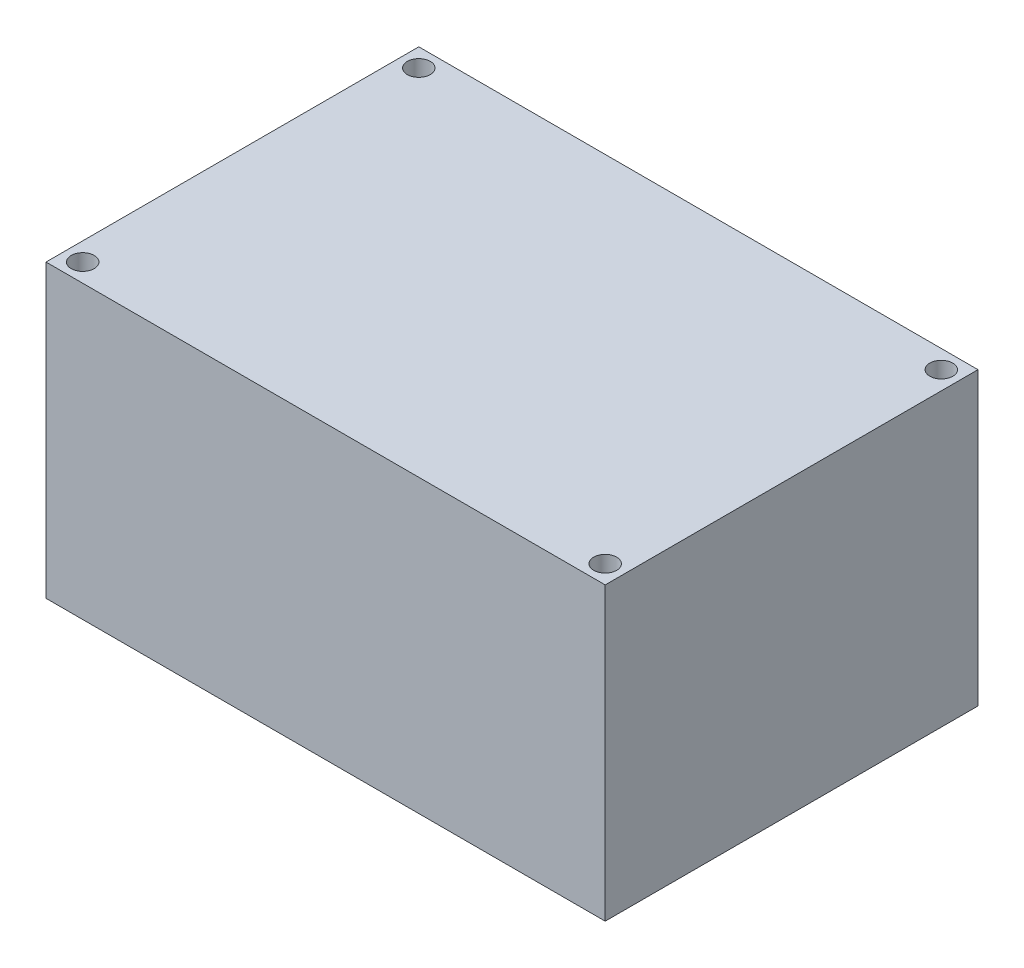
ISO-10303-21;
HEADER;
FILE_DESCRIPTION(('STEP AP214'),'2;1');
FILE_NAME('part.step','',(''),(''),'','','');
FILE_SCHEMA(('AUTOMOTIVE_DESIGN { 1 0 10303 214 1 1 1 1 }'));
ENDSEC;
DATA;
#1=APPLICATION_CONTEXT('core data for automotive mechanical design processes');
#2=APPLICATION_PROTOCOL_DEFINITION('international standard','automotive_design',2000,#1);
#3=PRODUCT_CONTEXT('',#1,'mechanical');
#4=PRODUCT('Part','Part','',(#3));
#5=PRODUCT_RELATED_PRODUCT_CATEGORY('part','',(#4));
#6=PRODUCT_DEFINITION_FORMATION('','',#4);
#7=PRODUCT_DEFINITION_CONTEXT('part definition',#1,'design');
#8=PRODUCT_DEFINITION('design','',#6,#7);
#9=PRODUCT_DEFINITION_SHAPE('','',#8);
#10=(LENGTH_UNIT() NAMED_UNIT(*) SI_UNIT(.MILLI.,.METRE.));
#11=(NAMED_UNIT(*) PLANE_ANGLE_UNIT() SI_UNIT($,.RADIAN.));
#12=(NAMED_UNIT(*) SI_UNIT($,.STERADIAN.) SOLID_ANGLE_UNIT());
#13=UNCERTAINTY_MEASURE_WITH_UNIT(LENGTH_MEASURE(1.E-05),#10,'distance_accuracy_value','');
#14=(GEOMETRIC_REPRESENTATION_CONTEXT(3) GLOBAL_UNCERTAINTY_ASSIGNED_CONTEXT((#13)) GLOBAL_UNIT_ASSIGNED_CONTEXT((#10,
#11,#12)) REPRESENTATION_CONTEXT('',''));
#15=CARTESIAN_POINT('',(0.,0.,0.));
#16=DIRECTION('',(0.,0.,1.));
#17=DIRECTION('',(1.,0.,0.));
#18=AXIS2_PLACEMENT_3D('',#15,#16,#17);
#19=CARTESIAN_POINT('',(0.,31.75,0.));
#20=DIRECTION('',(-1.,0.,0.));
#21=DIRECTION('',(0.,0.,1.));
#22=AXIS2_PLACEMENT_3D('',#19,#20,#21);
#23=PLANE('',#22);
#24=DIRECTION('',(0.,0.,-1.));
#25=VECTOR('',#24,1.);
#26=CARTESIAN_POINT('',(0.,0.,0.));
#27=LINE('',#26,#25);
#28=CARTESIAN_POINT('',(0.,0.,0.));
#29=VERTEX_POINT('',#28);
#30=CARTESIAN_POINT('',(0.,0.,-40.64));
#31=VERTEX_POINT('',#30);
#32=EDGE_CURVE('E100',#29,#31,#27,.T.);
#33=ORIENTED_EDGE('',*,*,#32,.T.);
#34=DIRECTION('',(0.,-1.,0.));
#35=VECTOR('',#34,1.);
#36=CARTESIAN_POINT('',(0.,31.75,-40.64));
#37=LINE('',#36,#35);
#38=CARTESIAN_POINT('',(0.,31.75,-40.64));
#39=VERTEX_POINT('',#38);
#40=EDGE_CURVE('E11',#39,#31,#37,.T.);
#41=ORIENTED_EDGE('',*,*,#40,.F.);
#42=DIRECTION('',(0.,0.,-1.));
#43=VECTOR('',#42,1.);
#44=CARTESIAN_POINT('',(0.,31.75,0.));
#45=LINE('',#44,#43);
#46=CARTESIAN_POINT('',(0.,31.75,0.));
#47=VERTEX_POINT('',#46);
#48=EDGE_CURVE('E86',#47,#39,#45,.T.);
#49=ORIENTED_EDGE('',*,*,#48,.F.);
#50=DIRECTION('',(0.,-1.,0.));
#51=VECTOR('',#50,1.);
#52=CARTESIAN_POINT('',(0.,31.75,0.));
#53=LINE('',#52,#51);
#54=EDGE_CURVE('E53',#47,#29,#53,.T.);
#55=ORIENTED_EDGE('',*,*,#54,.T.);
#56=EDGE_LOOP('',(#33,#41,#49,#55));
#57=FACE_BOUND('',#56,.T.);
#58=ADVANCED_FACE('F37',(#57),#23,.F.);
#59=CARTESIAN_POINT('',(0.,31.75,-40.64));
#60=DIRECTION('',(0.,0.,1.));
#61=DIRECTION('',(1.,0.,0.));
#62=AXIS2_PLACEMENT_3D('',#59,#60,#61);
#63=PLANE('',#62);
#64=DIRECTION('',(-1.,0.,0.));
#65=VECTOR('',#64,1.);
#66=CARTESIAN_POINT('',(0.,0.,-40.64));
#67=LINE('',#66,#65);
#68=CARTESIAN_POINT('',(-60.96,0.,-40.64));
#69=VERTEX_POINT('',#68);
#70=EDGE_CURVE('E91',#31,#69,#67,.T.);
#71=ORIENTED_EDGE('',*,*,#70,.T.);
#72=DIRECTION('',(0.,-1.,0.));
#73=VECTOR('',#72,1.);
#74=CARTESIAN_POINT('',(-60.96,31.75,-40.64));
#75=LINE('',#74,#73);
#76=CARTESIAN_POINT('',(-60.96,31.75,-40.64));
#77=VERTEX_POINT('',#76);
#78=EDGE_CURVE('E45',#77,#69,#75,.T.);
#79=ORIENTED_EDGE('',*,*,#78,.F.);
#80=DIRECTION('',(-1.,0.,0.));
#81=VECTOR('',#80,1.);
#82=CARTESIAN_POINT('',(0.,31.75,-40.64));
#83=LINE('',#82,#81);
#84=EDGE_CURVE('E78',#39,#77,#83,.T.);
#85=ORIENTED_EDGE('',*,*,#84,.F.);
#86=ORIENTED_EDGE('',*,*,#40,.T.);
#87=EDGE_LOOP('',(#71,#79,#85,#86));
#88=FACE_BOUND('',#87,.T.);
#89=ADVANCED_FACE('F90',(#88),#63,.F.);
#90=CARTESIAN_POINT('',(-60.96,31.75,0.));
#91=DIRECTION('',(-1.,0.,0.));
#92=DIRECTION('',(0.,0.,1.));
#93=AXIS2_PLACEMENT_3D('',#90,#91,#92);
#94=PLANE('',#93);
#95=DIRECTION('',(0.,0.,-1.));
#96=VECTOR('',#95,1.);
#97=CARTESIAN_POINT('',(-60.96,0.,0.));
#98=LINE('',#97,#96);
#99=CARTESIAN_POINT('',(-60.96,0.,0.));
#100=VERTEX_POINT('',#99);
#101=EDGE_CURVE('E104',#100,#69,#98,.T.);
#102=ORIENTED_EDGE('',*,*,#101,.F.);
#103=DIRECTION('',(0.,-1.,0.));
#104=VECTOR('',#103,1.);
#105=CARTESIAN_POINT('',(-60.96,31.75,0.));
#106=LINE('',#105,#104);
#107=CARTESIAN_POINT('',(-60.96,31.75,0.));
#108=VERTEX_POINT('',#107);
#109=EDGE_CURVE('E67',#108,#100,#106,.T.);
#110=ORIENTED_EDGE('',*,*,#109,.F.);
#111=DIRECTION('',(0.,0.,-1.));
#112=VECTOR('',#111,1.);
#113=CARTESIAN_POINT('',(-60.96,31.75,0.));
#114=LINE('',#113,#112);
#115=EDGE_CURVE('E85',#108,#77,#114,.T.);
#116=ORIENTED_EDGE('',*,*,#115,.T.);
#117=ORIENTED_EDGE('',*,*,#78,.T.);
#118=EDGE_LOOP('',(#102,#110,#116,#117));
#119=FACE_BOUND('',#118,.T.);
#120=ADVANCED_FACE('F94',(#119),#94,.T.);
#121=CARTESIAN_POINT('',(0.,31.75,0.));
#122=DIRECTION('',(0.,0.,1.));
#123=DIRECTION('',(1.,0.,0.));
#124=AXIS2_PLACEMENT_3D('',#121,#122,#123);
#125=PLANE('',#124);
#126=DIRECTION('',(-1.,0.,0.));
#127=VECTOR('',#126,1.);
#128=CARTESIAN_POINT('',(0.,0.,0.));
#129=LINE('',#128,#127);
#130=EDGE_CURVE('E106',#29,#100,#129,.T.);
#131=ORIENTED_EDGE('',*,*,#130,.F.);
#132=ORIENTED_EDGE('',*,*,#54,.F.);
#133=DIRECTION('',(-1.,0.,0.));
#134=VECTOR('',#133,1.);
#135=CARTESIAN_POINT('',(0.,31.75,0.));
#136=LINE('',#135,#134);
#137=EDGE_CURVE('E95',#47,#108,#136,.T.);
#138=ORIENTED_EDGE('',*,*,#137,.T.);
#139=ORIENTED_EDGE('',*,*,#109,.T.);
#140=EDGE_LOOP('',(#131,#132,#138,#139));
#141=FACE_BOUND('',#140,.T.);
#142=ADVANCED_FACE('F141',(#141),#125,.T.);
#143=CARTESIAN_POINT('',(0.,31.75,0.));
#144=DIRECTION('',(0.,1.,0.));
#145=DIRECTION('',(0.,0.,1.));
#146=AXIS2_PLACEMENT_3D('',#143,#144,#145);
#147=PLANE('',#146);
#148=CARTESIAN_POINT('',(-58.96,31.75,-2.));
#149=DIRECTION('',(0.,1.,0.));
#150=DIRECTION('',(0.,0.,1.));
#151=AXIS2_PLACEMENT_3D('',#148,#149,#150);
#152=CIRCLE('',#151,1.25195902446179);
#153=CARTESIAN_POINT('',(-58.96,31.75,-0.748040975538209));
#154=VERTEX_POINT('',#153);
#155=EDGE_CURVE('E121',#154,#154,#152,.T.);
#156=ORIENTED_EDGE('',*,*,#155,.F.);
#157=EDGE_LOOP('',(#156));
#158=FACE_BOUND('',#157,.T.);
#159=CARTESIAN_POINT('',(-58.96,31.75,-38.64));
#160=DIRECTION('',(0.,1.,0.));
#161=DIRECTION('',(0.,0.,1.));
#162=AXIS2_PLACEMENT_3D('',#159,#160,#161);
#163=CIRCLE('',#162,1.25249627932758);
#164=CARTESIAN_POINT('',(-58.96,31.75,-37.3875037206724));
#165=VERTEX_POINT('',#164);
#166=EDGE_CURVE('E127',#165,#165,#163,.T.);
#167=ORIENTED_EDGE('',*,*,#166,.F.);
#168=EDGE_LOOP('',(#167));
#169=FACE_BOUND('',#168,.T.);
#170=CARTESIAN_POINT('',(-1.99971202499648,31.75,-38.64));
#171=DIRECTION('',(0.,1.,0.));
#172=DIRECTION('',(0.,0.,1.));
#173=AXIS2_PLACEMENT_3D('',#170,#171,#172);
#174=CIRCLE('',#173,1.25);
#175=CARTESIAN_POINT('',(-1.99971202499648,31.75,-37.39));
#176=VERTEX_POINT('',#175);
#177=EDGE_CURVE('E115',#176,#176,#174,.T.);
#178=ORIENTED_EDGE('',*,*,#177,.F.);
#179=EDGE_LOOP('',(#178));
#180=FACE_BOUND('',#179,.T.);
#181=CARTESIAN_POINT('',(-1.99971202499648,31.75,-2.));
#182=DIRECTION('',(0.,1.,0.));
#183=DIRECTION('',(0.,0.,1.));
#184=AXIS2_PLACEMENT_3D('',#181,#182,#183);
#185=CIRCLE('',#184,1.24924995833157);
#186=CARTESIAN_POINT('',(-1.99971202499648,31.75,-0.750750041668428));
#187=VERTEX_POINT('',#186);
#188=EDGE_CURVE('E112',#187,#187,#185,.T.);
#189=ORIENTED_EDGE('',*,*,#188,.F.);
#190=EDGE_LOOP('',(#189));
#191=FACE_BOUND('',#190,.T.);
#192=ORIENTED_EDGE('',*,*,#48,.T.);
#193=ORIENTED_EDGE('',*,*,#84,.T.);
#194=ORIENTED_EDGE('',*,*,#115,.F.);
#195=ORIENTED_EDGE('',*,*,#137,.F.);
#196=EDGE_LOOP('',(#192,#193,#194,#195));
#197=FACE_BOUND('',#196,.T.);
#198=ADVANCED_FACE('F82',(#158,#169,#180,#191,#197),#147,.T.);
#199=CARTESIAN_POINT('',(0.,0.,0.));
#200=DIRECTION('',(0.,1.,0.));
#201=DIRECTION('',(0.,0.,1.));
#202=AXIS2_PLACEMENT_3D('',#199,#200,#201);
#203=PLANE('',#202);
#204=CARTESIAN_POINT('',(-58.96,0.,-2.));
#205=DIRECTION('',(0.,1.,0.));
#206=DIRECTION('',(0.,0.,1.));
#207=AXIS2_PLACEMENT_3D('',#204,#205,#206);
#208=CIRCLE('',#207,1.25195902446179);
#209=CARTESIAN_POINT('',(-58.96,0.,-0.748040975538209));
#210=VERTEX_POINT('',#209);
#211=EDGE_CURVE('E118',#210,#210,#208,.T.);
#212=ORIENTED_EDGE('',*,*,#211,.T.);
#213=EDGE_LOOP('',(#212));
#214=FACE_BOUND('',#213,.T.);
#215=CARTESIAN_POINT('',(-58.96,0.,-38.64));
#216=DIRECTION('',(0.,1.,0.));
#217=DIRECTION('',(0.,0.,1.));
#218=AXIS2_PLACEMENT_3D('',#215,#216,#217);
#219=CIRCLE('',#218,1.25249627932758);
#220=CARTESIAN_POINT('',(-58.96,0.,-37.3875037206724));
#221=VERTEX_POINT('',#220);
#222=EDGE_CURVE('E124',#221,#221,#219,.T.);
#223=ORIENTED_EDGE('',*,*,#222,.T.);
#224=EDGE_LOOP('',(#223));
#225=FACE_BOUND('',#224,.T.);
#226=CARTESIAN_POINT('',(-1.99971202499648,0.,-38.64));
#227=DIRECTION('',(0.,1.,0.));
#228=DIRECTION('',(0.,0.,1.));
#229=AXIS2_PLACEMENT_3D('',#226,#227,#228);
#230=CIRCLE('',#229,1.25);
#231=CARTESIAN_POINT('',(-1.99971202499648,0.,-37.39));
#232=VERTEX_POINT('',#231);
#233=EDGE_CURVE('E130',#232,#232,#230,.T.);
#234=ORIENTED_EDGE('',*,*,#233,.T.);
#235=EDGE_LOOP('',(#234));
#236=FACE_BOUND('',#235,.T.);
#237=CARTESIAN_POINT('',(-1.99971202499648,0.,-2.));
#238=DIRECTION('',(0.,1.,0.));
#239=DIRECTION('',(0.,0.,1.));
#240=AXIS2_PLACEMENT_3D('',#237,#238,#239);
#241=CIRCLE('',#240,1.24924995833157);
#242=CARTESIAN_POINT('',(-1.99971202499648,0.,-0.750750041668428));
#243=VERTEX_POINT('',#242);
#244=EDGE_CURVE('E102',#243,#243,#241,.T.);
#245=ORIENTED_EDGE('',*,*,#244,.T.);
#246=EDGE_LOOP('',(#245));
#247=FACE_BOUND('',#246,.T.);
#248=ORIENTED_EDGE('',*,*,#32,.F.);
#249=ORIENTED_EDGE('',*,*,#130,.T.);
#250=ORIENTED_EDGE('',*,*,#101,.T.);
#251=ORIENTED_EDGE('',*,*,#70,.F.);
#252=EDGE_LOOP('',(#248,#249,#250,#251));
#253=FACE_BOUND('',#252,.T.);
#254=ADVANCED_FACE('F140',(#214,#225,#236,#247,#253),#203,.F.);
#255=CARTESIAN_POINT('',(-1.99971202499648,0.,-2.));
#256=DIRECTION('',(0.,1.,0.));
#257=DIRECTION('',(0.,0.,1.));
#258=AXIS2_PLACEMENT_3D('',#255,#256,#257);
#259=CYLINDRICAL_SURFACE('',#258,1.24924995833157);
#260=ORIENTED_EDGE('',*,*,#244,.F.);
#261=EDGE_LOOP('',(#260));
#262=FACE_BOUND('',#261,.T.);
#263=ORIENTED_EDGE('',*,*,#188,.T.);
#264=EDGE_LOOP('',(#263));
#265=FACE_BOUND('',#264,.T.);
#266=ADVANCED_FACE('F146',(#262,#265),#259,.F.);
#267=CARTESIAN_POINT('',(-1.99971202499648,0.,-38.64));
#268=DIRECTION('',(0.,1.,0.));
#269=DIRECTION('',(0.,0.,1.));
#270=AXIS2_PLACEMENT_3D('',#267,#268,#269);
#271=CYLINDRICAL_SURFACE('',#270,1.25);
#272=ORIENTED_EDGE('',*,*,#233,.F.);
#273=EDGE_LOOP('',(#272));
#274=FACE_BOUND('',#273,.T.);
#275=ORIENTED_EDGE('',*,*,#177,.T.);
#276=EDGE_LOOP('',(#275));
#277=FACE_BOUND('',#276,.T.);
#278=ADVANCED_FACE('F136',(#274,#277),#271,.F.);
#279=CARTESIAN_POINT('',(-58.96,0.,-38.64));
#280=DIRECTION('',(0.,1.,0.));
#281=DIRECTION('',(0.,0.,1.));
#282=AXIS2_PLACEMENT_3D('',#279,#280,#281);
#283=CYLINDRICAL_SURFACE('',#282,1.25249627932758);
#284=ORIENTED_EDGE('',*,*,#222,.F.);
#285=EDGE_LOOP('',(#284));
#286=FACE_BOUND('',#285,.T.);
#287=ORIENTED_EDGE('',*,*,#166,.T.);
#288=EDGE_LOOP('',(#287));
#289=FACE_BOUND('',#288,.T.);
#290=ADVANCED_FACE('F154',(#286,#289),#283,.F.);
#291=CARTESIAN_POINT('',(-58.96,0.,-2.));
#292=DIRECTION('',(0.,1.,0.));
#293=DIRECTION('',(0.,0.,1.));
#294=AXIS2_PLACEMENT_3D('',#291,#292,#293);
#295=CYLINDRICAL_SURFACE('',#294,1.25195902446179);
#296=ORIENTED_EDGE('',*,*,#211,.F.);
#297=EDGE_LOOP('',(#296));
#298=FACE_BOUND('',#297,.T.);
#299=ORIENTED_EDGE('',*,*,#155,.T.);
#300=EDGE_LOOP('',(#299));
#301=FACE_BOUND('',#300,.T.);
#302=ADVANCED_FACE('F216',(#298,#301),#295,.F.);
#303=CLOSED_SHELL('',(#58,#89,#120,#142,#198,#254,#266,#278,#290,#302));
#304=MANIFOLD_SOLID_BREP('B2',#303);
#305=ADVANCED_BREP_SHAPE_REPRESENTATION('',(#18,#304),#14);
#306=SHAPE_DEFINITION_REPRESENTATION(#9,#305);
ENDSEC;
END-ISO-10303-21;
